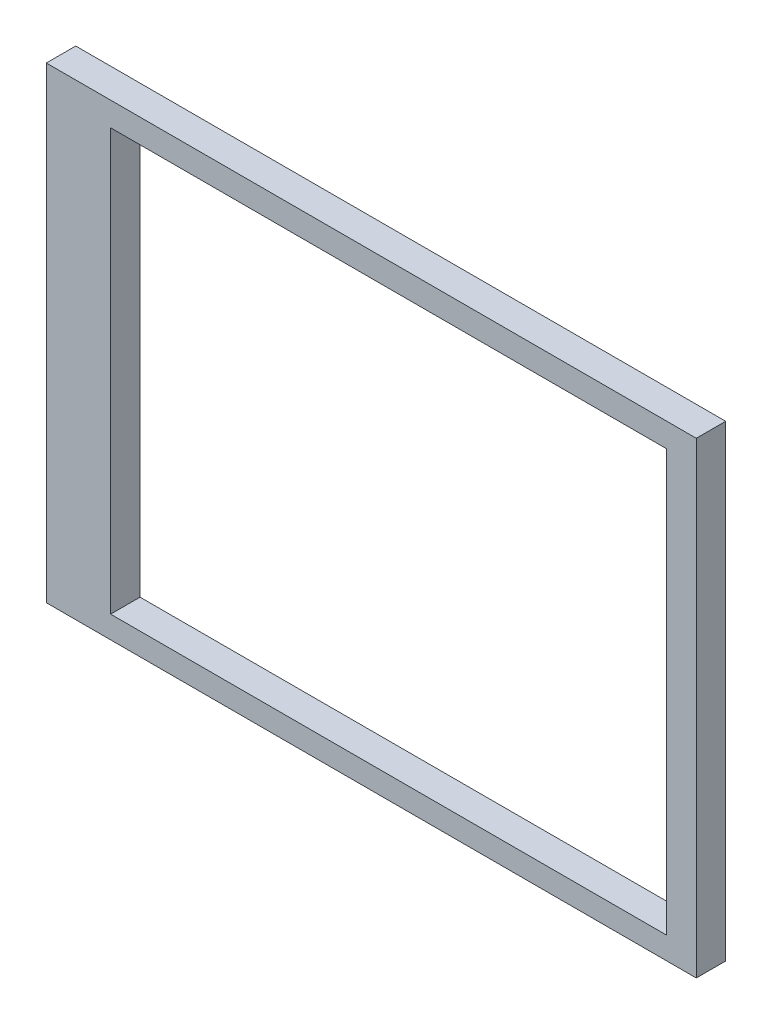
ISO-10303-21;
HEADER;
FILE_DESCRIPTION(('STEP AP214'),'2;1');
FILE_NAME('part.step','',(''),(''),'','','');
FILE_SCHEMA(('AUTOMOTIVE_DESIGN { 1 0 10303 214 1 1 1 1 }'));
ENDSEC;
DATA;
#1=APPLICATION_CONTEXT('core data for automotive mechanical design processes');
#2=APPLICATION_PROTOCOL_DEFINITION('international standard','automotive_design',2000,#1);
#3=PRODUCT_CONTEXT('',#1,'mechanical');
#4=PRODUCT('Part','Part','',(#3));
#5=PRODUCT_RELATED_PRODUCT_CATEGORY('part','',(#4));
#6=PRODUCT_DEFINITION_FORMATION('','',#4);
#7=PRODUCT_DEFINITION_CONTEXT('part definition',#1,'design');
#8=PRODUCT_DEFINITION('design','',#6,#7);
#9=PRODUCT_DEFINITION_SHAPE('','',#8);
#10=(LENGTH_UNIT() NAMED_UNIT(*) SI_UNIT(.MILLI.,.METRE.));
#11=(NAMED_UNIT(*) PLANE_ANGLE_UNIT() SI_UNIT($,.RADIAN.));
#12=(NAMED_UNIT(*) SI_UNIT($,.STERADIAN.) SOLID_ANGLE_UNIT());
#13=UNCERTAINTY_MEASURE_WITH_UNIT(LENGTH_MEASURE(1.E-05),#10,'distance_accuracy_value','');
#14=(GEOMETRIC_REPRESENTATION_CONTEXT(3) GLOBAL_UNCERTAINTY_ASSIGNED_CONTEXT((#13)) GLOBAL_UNIT_ASSIGNED_CONTEXT((#10,
#11,#12)) REPRESENTATION_CONTEXT('',''));
#15=CARTESIAN_POINT('',(0.,0.,0.));
#16=DIRECTION('',(0.,0.,1.));
#17=DIRECTION('',(1.,0.,0.));
#18=AXIS2_PLACEMENT_3D('',#15,#16,#17);
#19=CARTESIAN_POINT('',(0.,0.,2.8));
#20=DIRECTION('',(0.,0.,-1.));
#21=DIRECTION('',(-1.,0.,0.));
#22=AXIS2_PLACEMENT_3D('',#19,#20,#21);
#23=PLANE('',#22);
#24=DIRECTION('',(0.,-1.,0.));
#25=VECTOR('',#24,1.);
#26=CARTESIAN_POINT('',(-32.56,-22.16,2.8));
#27=LINE('',#26,#25);
#28=CARTESIAN_POINT('',(-32.56,22.32,2.8));
#29=VERTEX_POINT('',#28);
#30=CARTESIAN_POINT('',(-32.56,-22.16,2.8));
#31=VERTEX_POINT('',#30);
#32=EDGE_CURVE('E136',#29,#31,#27,.T.);
#33=ORIENTED_EDGE('',*,*,#32,.T.);
#34=DIRECTION('',(1.,0.,0.));
#35=VECTOR('',#34,1.);
#36=CARTESIAN_POINT('',(-32.56,-22.16,2.8));
#37=LINE('',#36,#35);
#38=CARTESIAN_POINT('',(29.29,-22.16,2.8));
#39=VERTEX_POINT('',#38);
#40=EDGE_CURVE('E139',#31,#39,#37,.T.);
#41=ORIENTED_EDGE('',*,*,#40,.T.);
#42=DIRECTION('',(0.,1.,0.));
#43=VECTOR('',#42,1.);
#44=CARTESIAN_POINT('',(29.29,-22.16,2.8));
#45=LINE('',#44,#43);
#46=CARTESIAN_POINT('',(29.29,22.32,2.8));
#47=VERTEX_POINT('',#46);
#48=EDGE_CURVE('E142',#39,#47,#45,.T.);
#49=ORIENTED_EDGE('',*,*,#48,.T.);
#50=DIRECTION('',(-1.,0.,0.));
#51=VECTOR('',#50,1.);
#52=CARTESIAN_POINT('',(-32.56,22.32,2.8));
#53=LINE('',#52,#51);
#54=EDGE_CURVE('E144',#47,#29,#53,.T.);
#55=ORIENTED_EDGE('',*,*,#54,.T.);
#56=EDGE_LOOP('',(#33,#41,#49,#55));
#57=FACE_BOUND('',#56,.T.);
#58=DIRECTION('',(0.,-1.,0.));
#59=VECTOR('',#58,1.);
#60=CARTESIAN_POINT('',(-26.44,20.04,2.8));
#61=LINE('',#60,#59);
#62=CARTESIAN_POINT('',(-26.44,20.04,2.8));
#63=VERTEX_POINT('',#62);
#64=CARTESIAN_POINT('',(-26.44,-20.04,2.8));
#65=VERTEX_POINT('',#64);
#66=EDGE_CURVE('E100',#63,#65,#61,.T.);
#67=ORIENTED_EDGE('',*,*,#66,.F.);
#68=DIRECTION('',(-1.,0.,0.));
#69=VECTOR('',#68,1.);
#70=CARTESIAN_POINT('',(-26.44,20.04,2.8));
#71=LINE('',#70,#69);
#72=CARTESIAN_POINT('',(26.44,20.04,2.8));
#73=VERTEX_POINT('',#72);
#74=EDGE_CURVE('E122',#73,#63,#71,.T.);
#75=ORIENTED_EDGE('',*,*,#74,.F.);
#76=DIRECTION('',(0.,1.,0.));
#77=VECTOR('',#76,1.);
#78=CARTESIAN_POINT('',(26.44,20.04,2.8));
#79=LINE('',#78,#77);
#80=CARTESIAN_POINT('',(26.44,-20.04,2.8));
#81=VERTEX_POINT('',#80);
#82=EDGE_CURVE('E120',#81,#73,#79,.T.);
#83=ORIENTED_EDGE('',*,*,#82,.F.);
#84=DIRECTION('',(1.,0.,0.));
#85=VECTOR('',#84,1.);
#86=CARTESIAN_POINT('',(-26.44,-20.04,2.8));
#87=LINE('',#86,#85);
#88=EDGE_CURVE('E108',#65,#81,#87,.T.);
#89=ORIENTED_EDGE('',*,*,#88,.F.);
#90=EDGE_LOOP('',(#67,#75,#83,#89));
#91=FACE_BOUND('',#90,.T.);
#92=ADVANCED_FACE('F35',(#57,#91),#23,.F.);
#93=CARTESIAN_POINT('',(0.,0.,0.));
#94=DIRECTION('',(0.,0.,-1.));
#95=DIRECTION('',(-1.,0.,0.));
#96=AXIS2_PLACEMENT_3D('',#93,#94,#95);
#97=PLANE('',#96);
#98=DIRECTION('',(0.,-1.,0.));
#99=VECTOR('',#98,1.);
#100=CARTESIAN_POINT('',(-32.56,-22.16,0.));
#101=LINE('',#100,#99);
#102=CARTESIAN_POINT('',(-32.56,22.32,0.));
#103=VERTEX_POINT('',#102);
#104=CARTESIAN_POINT('',(-32.56,-22.16,0.));
#105=VERTEX_POINT('',#104);
#106=EDGE_CURVE('E116',#103,#105,#101,.T.);
#107=ORIENTED_EDGE('',*,*,#106,.F.);
#108=DIRECTION('',(-1.,0.,0.));
#109=VECTOR('',#108,1.);
#110=CARTESIAN_POINT('',(-32.56,22.32,0.));
#111=LINE('',#110,#109);
#112=CARTESIAN_POINT('',(29.29,22.32,0.));
#113=VERTEX_POINT('',#112);
#114=EDGE_CURVE('E140',#113,#103,#111,.T.);
#115=ORIENTED_EDGE('',*,*,#114,.F.);
#116=DIRECTION('',(0.,1.,0.));
#117=VECTOR('',#116,1.);
#118=CARTESIAN_POINT('',(29.29,-22.16,0.));
#119=LINE('',#118,#117);
#120=CARTESIAN_POINT('',(29.29,-22.16,0.));
#121=VERTEX_POINT('',#120);
#122=EDGE_CURVE('E151',#121,#113,#119,.T.);
#123=ORIENTED_EDGE('',*,*,#122,.F.);
#124=DIRECTION('',(1.,0.,0.));
#125=VECTOR('',#124,1.);
#126=CARTESIAN_POINT('',(-32.56,-22.16,0.));
#127=LINE('',#126,#125);
#128=EDGE_CURVE('E149',#105,#121,#127,.T.);
#129=ORIENTED_EDGE('',*,*,#128,.F.);
#130=EDGE_LOOP('',(#107,#115,#123,#129));
#131=FACE_BOUND('',#130,.T.);
#132=DIRECTION('',(-1.,0.,0.));
#133=VECTOR('',#132,1.);
#134=CARTESIAN_POINT('',(-26.44,20.04,0.));
#135=LINE('',#134,#133);
#136=CARTESIAN_POINT('',(26.44,20.04,0.));
#137=VERTEX_POINT('',#136);
#138=CARTESIAN_POINT('',(-26.44,20.04,0.));
#139=VERTEX_POINT('',#138);
#140=EDGE_CURVE('E109',#137,#139,#135,.T.);
#141=ORIENTED_EDGE('',*,*,#140,.T.);
#142=DIRECTION('',(0.,-1.,0.));
#143=VECTOR('',#142,1.);
#144=CARTESIAN_POINT('',(-26.44,20.04,0.));
#145=LINE('',#144,#143);
#146=CARTESIAN_POINT('',(-26.44,-20.04,0.));
#147=VERTEX_POINT('',#146);
#148=EDGE_CURVE('E58',#139,#147,#145,.T.);
#149=ORIENTED_EDGE('',*,*,#148,.T.);
#150=DIRECTION('',(1.,0.,0.));
#151=VECTOR('',#150,1.);
#152=CARTESIAN_POINT('',(-26.44,-20.04,0.));
#153=LINE('',#152,#151);
#154=CARTESIAN_POINT('',(26.44,-20.04,0.));
#155=VERTEX_POINT('',#154);
#156=EDGE_CURVE('E115',#147,#155,#153,.T.);
#157=ORIENTED_EDGE('',*,*,#156,.T.);
#158=DIRECTION('',(0.,1.,0.));
#159=VECTOR('',#158,1.);
#160=CARTESIAN_POINT('',(26.44,20.04,0.));
#161=LINE('',#160,#159);
#162=EDGE_CURVE('E128',#155,#137,#161,.T.);
#163=ORIENTED_EDGE('',*,*,#162,.T.);
#164=EDGE_LOOP('',(#141,#149,#157,#163));
#165=FACE_BOUND('',#164,.T.);
#166=ADVANCED_FACE('F169',(#131,#165),#97,.T.);
#167=CARTESIAN_POINT('',(-32.56,-22.16,2.8));
#168=DIRECTION('',(1.,0.,0.));
#169=DIRECTION('',(0.,1.,0.));
#170=AXIS2_PLACEMENT_3D('',#167,#168,#169);
#171=PLANE('',#170);
#172=ORIENTED_EDGE('',*,*,#106,.T.);
#173=DIRECTION('',(0.,0.,-1.));
#174=VECTOR('',#173,1.);
#175=CARTESIAN_POINT('',(-32.56,-22.16,2.8));
#176=LINE('',#175,#174);
#177=EDGE_CURVE('E11',#31,#105,#176,.T.);
#178=ORIENTED_EDGE('',*,*,#177,.F.);
#179=ORIENTED_EDGE('',*,*,#32,.F.);
#180=DIRECTION('',(0.,0.,-1.));
#181=VECTOR('',#180,1.);
#182=CARTESIAN_POINT('',(-32.56,22.32,2.8));
#183=LINE('',#182,#181);
#184=EDGE_CURVE('E146',#29,#103,#183,.T.);
#185=ORIENTED_EDGE('',*,*,#184,.T.);
#186=EDGE_LOOP('',(#172,#178,#179,#185));
#187=FACE_BOUND('',#186,.T.);
#188=ADVANCED_FACE('F37',(#187),#171,.F.);
#189=CARTESIAN_POINT('',(-32.56,-22.16,2.8));
#190=DIRECTION('',(0.,1.,0.));
#191=DIRECTION('',(0.,0.,1.));
#192=AXIS2_PLACEMENT_3D('',#189,#190,#191);
#193=PLANE('',#192);
#194=ORIENTED_EDGE('',*,*,#128,.T.);
#195=DIRECTION('',(0.,0.,-1.));
#196=VECTOR('',#195,1.);
#197=CARTESIAN_POINT('',(29.29,-22.16,2.8));
#198=LINE('',#197,#196);
#199=EDGE_CURVE('E43',#39,#121,#198,.T.);
#200=ORIENTED_EDGE('',*,*,#199,.F.);
#201=ORIENTED_EDGE('',*,*,#40,.F.);
#202=ORIENTED_EDGE('',*,*,#177,.T.);
#203=EDGE_LOOP('',(#194,#200,#201,#202));
#204=FACE_BOUND('',#203,.T.);
#205=ADVANCED_FACE('F179',(#204),#193,.F.);
#206=CARTESIAN_POINT('',(29.29,-22.16,2.8));
#207=DIRECTION('',(-1.,0.,0.));
#208=DIRECTION('',(0.,0.,1.));
#209=AXIS2_PLACEMENT_3D('',#206,#207,#208);
#210=PLANE('',#209);
#211=ORIENTED_EDGE('',*,*,#122,.T.);
#212=DIRECTION('',(0.,0.,-1.));
#213=VECTOR('',#212,1.);
#214=CARTESIAN_POINT('',(29.29,22.32,2.8));
#215=LINE('',#214,#213);
#216=EDGE_CURVE('E156',#47,#113,#215,.T.);
#217=ORIENTED_EDGE('',*,*,#216,.F.);
#218=ORIENTED_EDGE('',*,*,#48,.F.);
#219=ORIENTED_EDGE('',*,*,#199,.T.);
#220=EDGE_LOOP('',(#211,#217,#218,#219));
#221=FACE_BOUND('',#220,.T.);
#222=ADVANCED_FACE('F163',(#221),#210,.F.);
#223=CARTESIAN_POINT('',(-32.56,22.32,2.8));
#224=DIRECTION('',(0.,-1.,0.));
#225=DIRECTION('',(1.,0.,0.));
#226=AXIS2_PLACEMENT_3D('',#223,#224,#225);
#227=PLANE('',#226);
#228=ORIENTED_EDGE('',*,*,#114,.T.);
#229=ORIENTED_EDGE('',*,*,#184,.F.);
#230=ORIENTED_EDGE('',*,*,#54,.F.);
#231=ORIENTED_EDGE('',*,*,#216,.T.);
#232=EDGE_LOOP('',(#228,#229,#230,#231));
#233=FACE_BOUND('',#232,.T.);
#234=ADVANCED_FACE('F173',(#233),#227,.F.);
#235=CARTESIAN_POINT('',(-26.44,20.04,2.8));
#236=DIRECTION('',(1.,0.,0.));
#237=DIRECTION('',(0.,0.,-1.));
#238=AXIS2_PLACEMENT_3D('',#235,#236,#237);
#239=PLANE('',#238);
#240=ORIENTED_EDGE('',*,*,#148,.F.);
#241=DIRECTION('',(0.,0.,-1.));
#242=VECTOR('',#241,1.);
#243=CARTESIAN_POINT('',(-26.44,20.04,2.8));
#244=LINE('',#243,#242);
#245=EDGE_CURVE('E104',#63,#139,#244,.T.);
#246=ORIENTED_EDGE('',*,*,#245,.F.);
#247=ORIENTED_EDGE('',*,*,#66,.T.);
#248=DIRECTION('',(0.,0.,-1.));
#249=VECTOR('',#248,1.);
#250=CARTESIAN_POINT('',(-26.44,-20.04,2.8));
#251=LINE('',#250,#249);
#252=EDGE_CURVE('E103',#65,#147,#251,.T.);
#253=ORIENTED_EDGE('',*,*,#252,.T.);
#254=EDGE_LOOP('',(#240,#246,#247,#253));
#255=FACE_BOUND('',#254,.T.);
#256=ADVANCED_FACE('F102',(#255),#239,.T.);
#257=CARTESIAN_POINT('',(-26.44,-20.04,2.8));
#258=DIRECTION('',(0.,1.,0.));
#259=DIRECTION('',(-1.,0.,0.));
#260=AXIS2_PLACEMENT_3D('',#257,#258,#259);
#261=PLANE('',#260);
#262=ORIENTED_EDGE('',*,*,#156,.F.);
#263=ORIENTED_EDGE('',*,*,#252,.F.);
#264=ORIENTED_EDGE('',*,*,#88,.T.);
#265=DIRECTION('',(0.,0.,-1.));
#266=VECTOR('',#265,1.);
#267=CARTESIAN_POINT('',(26.44,-20.04,2.8));
#268=LINE('',#267,#266);
#269=EDGE_CURVE('E117',#81,#155,#268,.T.);
#270=ORIENTED_EDGE('',*,*,#269,.T.);
#271=EDGE_LOOP('',(#262,#263,#264,#270));
#272=FACE_BOUND('',#271,.T.);
#273=ADVANCED_FACE('F112',(#272),#261,.T.);
#274=CARTESIAN_POINT('',(26.44,20.04,2.8));
#275=DIRECTION('',(-1.,0.,0.));
#276=DIRECTION('',(0.,0.,1.));
#277=AXIS2_PLACEMENT_3D('',#274,#275,#276);
#278=PLANE('',#277);
#279=ORIENTED_EDGE('',*,*,#162,.F.);
#280=ORIENTED_EDGE('',*,*,#269,.F.);
#281=ORIENTED_EDGE('',*,*,#82,.T.);
#282=DIRECTION('',(0.,0.,-1.));
#283=VECTOR('',#282,1.);
#284=CARTESIAN_POINT('',(26.44,20.04,2.8));
#285=LINE('',#284,#283);
#286=EDGE_CURVE('E50',#73,#137,#285,.T.);
#287=ORIENTED_EDGE('',*,*,#286,.T.);
#288=EDGE_LOOP('',(#279,#280,#281,#287));
#289=FACE_BOUND('',#288,.T.);
#290=ADVANCED_FACE('F202',(#289),#278,.T.);
#291=CARTESIAN_POINT('',(-26.44,20.04,2.8));
#292=DIRECTION('',(0.,-1.,0.));
#293=DIRECTION('',(1.,0.,0.));
#294=AXIS2_PLACEMENT_3D('',#291,#292,#293);
#295=PLANE('',#294);
#296=ORIENTED_EDGE('',*,*,#140,.F.);
#297=ORIENTED_EDGE('',*,*,#286,.F.);
#298=ORIENTED_EDGE('',*,*,#74,.T.);
#299=ORIENTED_EDGE('',*,*,#245,.T.);
#300=EDGE_LOOP('',(#296,#297,#298,#299));
#301=FACE_BOUND('',#300,.T.);
#302=ADVANCED_FACE('F206',(#301),#295,.T.);
#303=CLOSED_SHELL('',(#92,#166,#188,#205,#222,#234,#256,#273,#290,#302));
#304=MANIFOLD_SOLID_BREP('B2',#303);
#305=ADVANCED_BREP_SHAPE_REPRESENTATION('',(#18,#304),#14);
#306=SHAPE_DEFINITION_REPRESENTATION(#9,#305);
ENDSEC;
END-ISO-10303-21;
